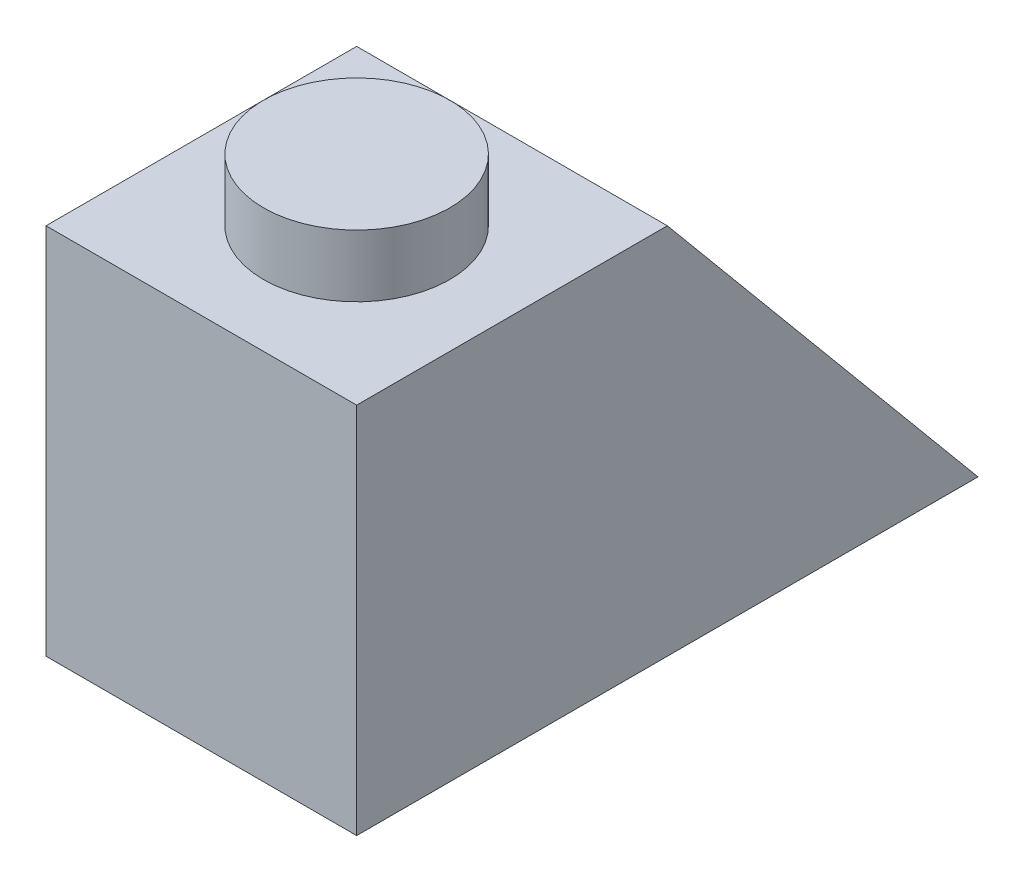
ISO-10303-21;
HEADER;
FILE_DESCRIPTION(('STEP AP214'),'2;1');
FILE_NAME('part.step','',(''),(''),'','','');
FILE_SCHEMA(('AUTOMOTIVE_DESIGN { 1 0 10303 214 1 1 1 1 }'));
ENDSEC;
DATA;
#1=APPLICATION_CONTEXT('core data for automotive mechanical design processes');
#2=APPLICATION_PROTOCOL_DEFINITION('international standard','automotive_design',2000,#1);
#3=PRODUCT_CONTEXT('',#1,'mechanical');
#4=PRODUCT('Part','Part','',(#3));
#5=PRODUCT_RELATED_PRODUCT_CATEGORY('part','',(#4));
#6=PRODUCT_DEFINITION_FORMATION('','',#4);
#7=PRODUCT_DEFINITION_CONTEXT('part definition',#1,'design');
#8=PRODUCT_DEFINITION('design','',#6,#7);
#9=PRODUCT_DEFINITION_SHAPE('','',#8);
#10=(LENGTH_UNIT() NAMED_UNIT(*) SI_UNIT(.MILLI.,.METRE.));
#11=(NAMED_UNIT(*) PLANE_ANGLE_UNIT() SI_UNIT($,.RADIAN.));
#12=(NAMED_UNIT(*) SI_UNIT($,.STERADIAN.) SOLID_ANGLE_UNIT());
#13=UNCERTAINTY_MEASURE_WITH_UNIT(LENGTH_MEASURE(1.E-05),#10,'distance_accuracy_value','');
#14=(GEOMETRIC_REPRESENTATION_CONTEXT(3) GLOBAL_UNCERTAINTY_ASSIGNED_CONTEXT((#13)) GLOBAL_UNIT_ASSIGNED_CONTEXT((#10,
#11,#12)) REPRESENTATION_CONTEXT('',''));
#15=CARTESIAN_POINT('',(0.,0.,0.));
#16=DIRECTION('',(0.,0.,1.));
#17=DIRECTION('',(1.,0.,0.));
#18=AXIS2_PLACEMENT_3D('',#15,#16,#17);
#19=CARTESIAN_POINT('',(8.,0.,0.));
#20=DIRECTION('',(0.,1.,0.));
#21=DIRECTION('',(0.,0.,1.));
#22=AXIS2_PLACEMENT_3D('',#19,#20,#21);
#23=PLANE('',#22);
#24=DIRECTION('',(0.,0.,-1.));
#25=VECTOR('',#24,1.);
#26=CARTESIAN_POINT('',(0.,0.,0.));
#27=LINE('',#26,#25);
#28=CARTESIAN_POINT('',(0.,0.,0.));
#29=VERTEX_POINT('',#28);
#30=CARTESIAN_POINT('',(0.,0.,-16.));
#31=VERTEX_POINT('',#30);
#32=EDGE_CURVE('E193',#29,#31,#27,.T.);
#33=ORIENTED_EDGE('',*,*,#32,.T.);
#34=DIRECTION('',(-1.,0.,0.));
#35=VECTOR('',#34,1.);
#36=CARTESIAN_POINT('',(8.,0.,-16.));
#37=LINE('',#36,#35);
#38=CARTESIAN_POINT('',(8.,0.,-16.));
#39=VERTEX_POINT('',#38);
#40=EDGE_CURVE('E205',#39,#31,#37,.T.);
#41=ORIENTED_EDGE('',*,*,#40,.F.);
#42=DIRECTION('',(0.,0.,-1.));
#43=VECTOR('',#42,1.);
#44=CARTESIAN_POINT('',(8.,0.,0.));
#45=LINE('',#44,#43);
#46=CARTESIAN_POINT('',(8.,0.,0.));
#47=VERTEX_POINT('',#46);
#48=EDGE_CURVE('E93',#47,#39,#45,.T.);
#49=ORIENTED_EDGE('',*,*,#48,.F.);
#50=DIRECTION('',(-1.,0.,0.));
#51=VECTOR('',#50,1.);
#52=CARTESIAN_POINT('',(8.,0.,0.));
#53=LINE('',#52,#51);
#54=EDGE_CURVE('E42',#47,#29,#53,.T.);
#55=ORIENTED_EDGE('',*,*,#54,.T.);
#56=EDGE_LOOP('',(#33,#41,#49,#55));
#57=FACE_BOUND('',#56,.T.);
#58=DIRECTION('',(0.,0.,-1.));
#59=VECTOR('',#58,1.);
#60=CARTESIAN_POINT('',(1.6,0.,0.));
#61=LINE('',#60,#59);
#62=CARTESIAN_POINT('',(1.6,0.,-1.6));
#63=VERTEX_POINT('',#62);
#64=CARTESIAN_POINT('',(1.6,0.,-13.9172667530916));
#65=VERTEX_POINT('',#64);
#66=EDGE_CURVE('E140',#63,#65,#61,.T.);
#67=ORIENTED_EDGE('',*,*,#66,.F.);
#68=DIRECTION('',(-1.,0.,0.));
#69=VECTOR('',#68,1.);
#70=CARTESIAN_POINT('',(8.,0.,-1.6));
#71=LINE('',#70,#69);
#72=CARTESIAN_POINT('',(6.4,0.,-1.6));
#73=VERTEX_POINT('',#72);
#74=EDGE_CURVE('E138',#73,#63,#71,.T.);
#75=ORIENTED_EDGE('',*,*,#74,.F.);
#76=DIRECTION('',(0.,0.,-1.));
#77=VECTOR('',#76,1.);
#78=CARTESIAN_POINT('',(6.4,0.,0.));
#79=LINE('',#78,#77);
#80=CARTESIAN_POINT('',(6.4,0.,-13.9172667530916));
#81=VERTEX_POINT('',#80);
#82=EDGE_CURVE('E150',#73,#81,#79,.T.);
#83=ORIENTED_EDGE('',*,*,#82,.T.);
#84=DIRECTION('',(-1.,0.,0.));
#85=VECTOR('',#84,1.);
#86=CARTESIAN_POINT('',(8.,0.,-13.9172667530916));
#87=LINE('',#86,#85);
#88=EDGE_CURVE('E162',#81,#65,#87,.T.);
#89=ORIENTED_EDGE('',*,*,#88,.T.);
#90=EDGE_LOOP('',(#67,#75,#83,#89));
#91=FACE_BOUND('',#90,.T.);
#92=ADVANCED_FACE('F38',(#57,#91),#23,.F.);
#93=CARTESIAN_POINT('',(8.,9.6,0.));
#94=DIRECTION('',(0.,0.,-1.));
#95=DIRECTION('',(-1.,0.,0.));
#96=AXIS2_PLACEMENT_3D('',#93,#94,#95);
#97=PLANE('',#96);
#98=DIRECTION('',(0.,-1.,0.));
#99=VECTOR('',#98,1.);
#100=CARTESIAN_POINT('',(0.,9.6,0.));
#101=LINE('',#100,#99);
#102=CARTESIAN_POINT('',(0.,9.6,0.));
#103=VERTEX_POINT('',#102);
#104=EDGE_CURVE('E177',#103,#29,#101,.T.);
#105=ORIENTED_EDGE('',*,*,#104,.T.);
#106=ORIENTED_EDGE('',*,*,#54,.F.);
#107=DIRECTION('',(0.,-1.,0.));
#108=VECTOR('',#107,1.);
#109=CARTESIAN_POINT('',(8.,9.6,0.));
#110=LINE('',#109,#108);
#111=CARTESIAN_POINT('',(8.,9.6,0.));
#112=VERTEX_POINT('',#111);
#113=EDGE_CURVE('E179',#112,#47,#110,.T.);
#114=ORIENTED_EDGE('',*,*,#113,.F.);
#115=DIRECTION('',(-1.,0.,0.));
#116=VECTOR('',#115,1.);
#117=CARTESIAN_POINT('',(8.,9.6,0.));
#118=LINE('',#117,#116);
#119=EDGE_CURVE('E189',#112,#103,#118,.T.);
#120=ORIENTED_EDGE('',*,*,#119,.T.);
#121=EDGE_LOOP('',(#105,#106,#114,#120));
#122=FACE_BOUND('',#121,.T.);
#123=ADVANCED_FACE('F40',(#122),#97,.F.);
#124=CARTESIAN_POINT('',(8.,0.,-16.));
#125=DIRECTION('',(0.,-0.64018439966448,0.768221279597376));
#126=DIRECTION('',(0.,-0.768221279597376,-0.64018439966448));
#127=AXIS2_PLACEMENT_3D('',#124,#125,#126);
#128=PLANE('',#127);
#129=DIRECTION('',(0.,0.768221279597376,0.64018439966448));
#130=VECTOR('',#129,1.);
#131=CARTESIAN_POINT('',(0.,0.,-16.));
#132=LINE('',#131,#130);
#133=CARTESIAN_POINT('',(0.,9.6,-8.));
#134=VERTEX_POINT('',#133);
#135=EDGE_CURVE('E196',#31,#134,#132,.T.);
#136=ORIENTED_EDGE('',*,*,#135,.T.);
#137=DIRECTION('',(-1.,0.,0.));
#138=VECTOR('',#137,1.);
#139=CARTESIAN_POINT('',(8.,9.6,-8.));
#140=LINE('',#139,#138);
#141=CARTESIAN_POINT('',(8.,9.6,-8.));
#142=VERTEX_POINT('',#141);
#143=EDGE_CURVE('E203',#142,#134,#140,.T.);
#144=ORIENTED_EDGE('',*,*,#143,.F.);
#145=DIRECTION('',(0.,0.768221279597376,0.64018439966448));
#146=VECTOR('',#145,1.);
#147=CARTESIAN_POINT('',(8.,0.,-16.));
#148=LINE('',#147,#146);
#149=EDGE_CURVE('E184',#39,#142,#148,.T.);
#150=ORIENTED_EDGE('',*,*,#149,.F.);
#151=ORIENTED_EDGE('',*,*,#40,.T.);
#152=EDGE_LOOP('',(#136,#144,#150,#151));
#153=FACE_BOUND('',#152,.T.);
#154=ADVANCED_FACE('F220',(#153),#128,.F.);
#155=CARTESIAN_POINT('',(8.,9.6,-8.));
#156=DIRECTION('',(0.,-1.,0.));
#157=DIRECTION('',(0.,0.,-1.));
#158=AXIS2_PLACEMENT_3D('',#155,#156,#157);
#159=PLANE('',#158);
#160=CARTESIAN_POINT('',(4.,9.6,-4.));
#161=DIRECTION('',(0.,1.,0.));
#162=DIRECTION('',(0.,0.,1.));
#163=AXIS2_PLACEMENT_3D('',#160,#161,#162);
#164=CIRCLE('',#163,2.4);
#165=CARTESIAN_POINT('',(4.,9.6,-1.6));
#166=VERTEX_POINT('',#165);
#167=EDGE_CURVE('E11',#166,#166,#164,.T.);
#168=ORIENTED_EDGE('',*,*,#167,.F.);
#169=EDGE_LOOP('',(#168));
#170=FACE_BOUND('',#169,.T.);
#171=DIRECTION('',(0.,0.,1.));
#172=VECTOR('',#171,1.);
#173=CARTESIAN_POINT('',(0.,9.6,-8.));
#174=LINE('',#173,#172);
#175=EDGE_CURVE('E85',#134,#103,#174,.T.);
#176=ORIENTED_EDGE('',*,*,#175,.T.);
#177=ORIENTED_EDGE('',*,*,#119,.F.);
#178=DIRECTION('',(0.,0.,1.));
#179=VECTOR('',#178,1.);
#180=CARTESIAN_POINT('',(8.,9.6,-8.));
#181=LINE('',#180,#179);
#182=EDGE_CURVE('E64',#142,#112,#181,.T.);
#183=ORIENTED_EDGE('',*,*,#182,.F.);
#184=ORIENTED_EDGE('',*,*,#143,.T.);
#185=EDGE_LOOP('',(#176,#177,#183,#184));
#186=FACE_BOUND('',#185,.T.);
#187=ADVANCED_FACE('F221',(#170,#186),#159,.F.);
#188=CARTESIAN_POINT('',(8.,0.,0.));
#189=DIRECTION('',(1.,0.,0.));
#190=DIRECTION('',(0.,0.,-1.));
#191=AXIS2_PLACEMENT_3D('',#188,#189,#190);
#192=PLANE('',#191);
#193=ORIENTED_EDGE('',*,*,#113,.T.);
#194=ORIENTED_EDGE('',*,*,#48,.T.);
#195=ORIENTED_EDGE('',*,*,#149,.T.);
#196=ORIENTED_EDGE('',*,*,#182,.T.);
#197=EDGE_LOOP('',(#193,#194,#195,#196));
#198=FACE_BOUND('',#197,.T.);
#199=ADVANCED_FACE('F222',(#198),#192,.T.);
#200=CARTESIAN_POINT('',(0.,0.,0.));
#201=DIRECTION('',(1.,0.,0.));
#202=DIRECTION('',(0.,0.,-1.));
#203=AXIS2_PLACEMENT_3D('',#200,#201,#202);
#204=PLANE('',#203);
#205=ORIENTED_EDGE('',*,*,#104,.F.);
#206=ORIENTED_EDGE('',*,*,#175,.F.);
#207=ORIENTED_EDGE('',*,*,#135,.F.);
#208=ORIENTED_EDGE('',*,*,#32,.F.);
#209=EDGE_LOOP('',(#205,#206,#207,#208));
#210=FACE_BOUND('',#209,.T.);
#211=ADVANCED_FACE('F218',(#210),#204,.F.);
#212=CARTESIAN_POINT('',(4.,11.2,-4.));
#213=DIRECTION('',(0.,-1.,0.));
#214=DIRECTION('',(0.,0.,-1.));
#215=AXIS2_PLACEMENT_3D('',#212,#213,#214);
#216=CYLINDRICAL_SURFACE('',#215,2.4);
#217=CARTESIAN_POINT('',(4.,11.2,-4.));
#218=DIRECTION('',(0.,1.,0.));
#219=DIRECTION('',(0.,0.,1.));
#220=AXIS2_PLACEMENT_3D('',#217,#218,#219);
#221=CIRCLE('',#220,2.4);
#222=CARTESIAN_POINT('',(4.,11.2,-1.6));
#223=VERTEX_POINT('',#222);
#224=EDGE_CURVE('E155',#223,#223,#221,.T.);
#225=ORIENTED_EDGE('',*,*,#224,.F.);
#226=EDGE_LOOP('',(#225));
#227=FACE_BOUND('',#226,.T.);
#228=ORIENTED_EDGE('',*,*,#167,.T.);
#229=EDGE_LOOP('',(#228));
#230=FACE_BOUND('',#229,.T.);
#231=ADVANCED_FACE('F229',(#227,#230),#216,.T.);
#232=CARTESIAN_POINT('',(4.,11.2,-4.));
#233=DIRECTION('',(0.,1.,0.));
#234=DIRECTION('',(0.,0.,1.));
#235=AXIS2_PLACEMENT_3D('',#232,#233,#234);
#236=PLANE('',#235);
#237=ORIENTED_EDGE('',*,*,#224,.T.);
#238=EDGE_LOOP('',(#237));
#239=FACE_BOUND('',#238,.T.);
#240=ADVANCED_FACE('F262',(#239),#236,.T.);
#241=CARTESIAN_POINT('',(8.,9.6,-1.6));
#242=DIRECTION('',(0.,0.,-1.));
#243=DIRECTION('',(-1.,0.,0.));
#244=AXIS2_PLACEMENT_3D('',#241,#242,#243);
#245=PLANE('',#244);
#246=DIRECTION('',(0.,-1.,0.));
#247=VECTOR('',#246,1.);
#248=CARTESIAN_POINT('',(1.6,9.6,-1.6));
#249=LINE('',#248,#247);
#250=CARTESIAN_POINT('',(1.6,8.,-1.6));
#251=VERTEX_POINT('',#250);
#252=EDGE_CURVE('E120',#251,#63,#249,.T.);
#253=ORIENTED_EDGE('',*,*,#252,.F.);
#254=DIRECTION('',(-1.,0.,0.));
#255=VECTOR('',#254,1.);
#256=CARTESIAN_POINT('',(8.,8.,-1.6));
#257=LINE('',#256,#255);
#258=CARTESIAN_POINT('',(6.4,8.,-1.6));
#259=VERTEX_POINT('',#258);
#260=EDGE_CURVE('E129',#259,#251,#257,.T.);
#261=ORIENTED_EDGE('',*,*,#260,.F.);
#262=DIRECTION('',(0.,-1.,0.));
#263=VECTOR('',#262,1.);
#264=CARTESIAN_POINT('',(6.4,9.6,-1.6));
#265=LINE('',#264,#263);
#266=EDGE_CURVE('E55',#259,#73,#265,.T.);
#267=ORIENTED_EDGE('',*,*,#266,.T.);
#268=ORIENTED_EDGE('',*,*,#74,.T.);
#269=EDGE_LOOP('',(#253,#261,#267,#268));
#270=FACE_BOUND('',#269,.T.);
#271=ADVANCED_FACE('F136',(#270),#245,.T.);
#272=CARTESIAN_POINT('',(8.,-1.02429503946317,-14.7708459526442));
#273=DIRECTION('',(0.,-0.64018439966448,0.768221279597376));
#274=DIRECTION('',(0.,-0.768221279597376,-0.64018439966448));
#275=AXIS2_PLACEMENT_3D('',#272,#273,#274);
#276=PLANE('',#275);
#277=DIRECTION('',(0.,0.768221279597376,0.64018439966448));
#278=VECTOR('',#277,1.);
#279=CARTESIAN_POINT('',(1.6,-1.02429503946317,-14.7708459526442));
#280=LINE('',#279,#278);
#281=CARTESIAN_POINT('',(1.6,8.,-7.25060008642489));
#282=VERTEX_POINT('',#281);
#283=EDGE_CURVE('E123',#65,#282,#280,.T.);
#284=ORIENTED_EDGE('',*,*,#283,.F.);
#285=ORIENTED_EDGE('',*,*,#88,.F.);
#286=DIRECTION('',(0.,0.768221279597376,0.64018439966448));
#287=VECTOR('',#286,1.);
#288=CARTESIAN_POINT('',(6.4,-1.02429503946317,-14.7708459526442));
#289=LINE('',#288,#287);
#290=CARTESIAN_POINT('',(6.4,8.,-7.25060008642489));
#291=VERTEX_POINT('',#290);
#292=EDGE_CURVE('E159',#81,#291,#289,.T.);
#293=ORIENTED_EDGE('',*,*,#292,.T.);
#294=DIRECTION('',(-1.,0.,0.));
#295=VECTOR('',#294,1.);
#296=CARTESIAN_POINT('',(8.,8.,-7.25060008642489));
#297=LINE('',#296,#295);
#298=EDGE_CURVE('E134',#291,#282,#297,.T.);
#299=ORIENTED_EDGE('',*,*,#298,.T.);
#300=EDGE_LOOP('',(#284,#285,#293,#299));
#301=FACE_BOUND('',#300,.T.);
#302=ADVANCED_FACE('F283',(#301),#276,.T.);
#303=CARTESIAN_POINT('',(8.,8.,-8.));
#304=DIRECTION('',(0.,-1.,0.));
#305=DIRECTION('',(0.,0.,-1.));
#306=AXIS2_PLACEMENT_3D('',#303,#304,#305);
#307=PLANE('',#306);
#308=CARTESIAN_POINT('',(4.,8.,-4.));
#309=DIRECTION('',(0.,-1.,0.));
#310=DIRECTION('',(0.,0.,-1.));
#311=AXIS2_PLACEMENT_3D('',#308,#309,#310);
#312=CIRCLE('',#311,0.8);
#313=CARTESIAN_POINT('',(4.,8.,-4.8));
#314=VERTEX_POINT('',#313);
#315=EDGE_CURVE('E152',#314,#314,#312,.F.);
#316=ORIENTED_EDGE('',*,*,#315,.T.);
#317=EDGE_LOOP('',(#316));
#318=FACE_BOUND('',#317,.T.);
#319=DIRECTION('',(0.,0.,1.));
#320=VECTOR('',#319,1.);
#321=CARTESIAN_POINT('',(1.6,8.,-8.));
#322=LINE('',#321,#320);
#323=EDGE_CURVE('E116',#282,#251,#322,.T.);
#324=ORIENTED_EDGE('',*,*,#323,.F.);
#325=ORIENTED_EDGE('',*,*,#298,.F.);
#326=DIRECTION('',(0.,0.,1.));
#327=VECTOR('',#326,1.);
#328=CARTESIAN_POINT('',(6.4,8.,-8.));
#329=LINE('',#328,#327);
#330=EDGE_CURVE('E132',#291,#259,#329,.T.);
#331=ORIENTED_EDGE('',*,*,#330,.T.);
#332=ORIENTED_EDGE('',*,*,#260,.T.);
#333=EDGE_LOOP('',(#324,#325,#331,#332));
#334=FACE_BOUND('',#333,.T.);
#335=ADVANCED_FACE('F130',(#318,#334),#307,.T.);
#336=CARTESIAN_POINT('',(6.4,0.,0.));
#337=DIRECTION('',(1.,0.,0.));
#338=DIRECTION('',(0.,0.,-1.));
#339=AXIS2_PLACEMENT_3D('',#336,#337,#338);
#340=PLANE('',#339);
#341=ORIENTED_EDGE('',*,*,#266,.F.);
#342=ORIENTED_EDGE('',*,*,#330,.F.);
#343=ORIENTED_EDGE('',*,*,#292,.F.);
#344=ORIENTED_EDGE('',*,*,#82,.F.);
#345=EDGE_LOOP('',(#341,#342,#343,#344));
#346=FACE_BOUND('',#345,.T.);
#347=ADVANCED_FACE('F299',(#346),#340,.F.);
#348=CARTESIAN_POINT('',(1.6,0.,0.));
#349=DIRECTION('',(1.,0.,0.));
#350=DIRECTION('',(0.,0.,-1.));
#351=AXIS2_PLACEMENT_3D('',#348,#349,#350);
#352=PLANE('',#351);
#353=ORIENTED_EDGE('',*,*,#252,.T.);
#354=ORIENTED_EDGE('',*,*,#66,.T.);
#355=ORIENTED_EDGE('',*,*,#283,.T.);
#356=ORIENTED_EDGE('',*,*,#323,.T.);
#357=EDGE_LOOP('',(#353,#354,#355,#356));
#358=FACE_BOUND('',#357,.T.);
#359=ADVANCED_FACE('F118',(#358),#352,.T.);
#360=CARTESIAN_POINT('',(4.,11.2,-4.));
#361=DIRECTION('',(0.,-1.,0.));
#362=DIRECTION('',(0.,0.,-1.));
#363=AXIS2_PLACEMENT_3D('',#360,#361,#362);
#364=CYLINDRICAL_SURFACE('',#363,0.8);
#365=CARTESIAN_POINT('',(4.,9.6,-4.));
#366=DIRECTION('',(0.,1.,0.));
#367=DIRECTION('',(0.,0.,1.));
#368=AXIS2_PLACEMENT_3D('',#365,#366,#367);
#369=CIRCLE('',#368,0.8);
#370=CARTESIAN_POINT('',(4.,9.6,-3.2));
#371=VERTEX_POINT('',#370);
#372=EDGE_CURVE('E141',#371,#371,#369,.T.);
#373=ORIENTED_EDGE('',*,*,#372,.T.);
#374=EDGE_LOOP('',(#373));
#375=FACE_BOUND('',#374,.T.);
#376=ORIENTED_EDGE('',*,*,#315,.F.);
#377=EDGE_LOOP('',(#376));
#378=FACE_BOUND('',#377,.T.);
#379=ADVANCED_FACE('F316',(#375,#378),#364,.F.);
#380=CARTESIAN_POINT('',(4.,9.6,-4.));
#381=DIRECTION('',(0.,1.,0.));
#382=DIRECTION('',(0.,0.,1.));
#383=AXIS2_PLACEMENT_3D('',#380,#381,#382);
#384=PLANE('',#383);
#385=ORIENTED_EDGE('',*,*,#372,.F.);
#386=EDGE_LOOP('',(#385));
#387=FACE_BOUND('',#386,.T.);
#388=ADVANCED_FACE('F324',(#387),#384,.F.);
#389=CLOSED_SHELL('',(#92,#123,#154,#187,#199,#211,#231,#240,#271,#302,#335,#347,#359,#379,#388));
#390=MANIFOLD_SOLID_BREP('B2',#389);
#391=ADVANCED_BREP_SHAPE_REPRESENTATION('',(#18,#390),#14);
#392=SHAPE_DEFINITION_REPRESENTATION(#9,#391);
ENDSEC;
END-ISO-10303-21;
